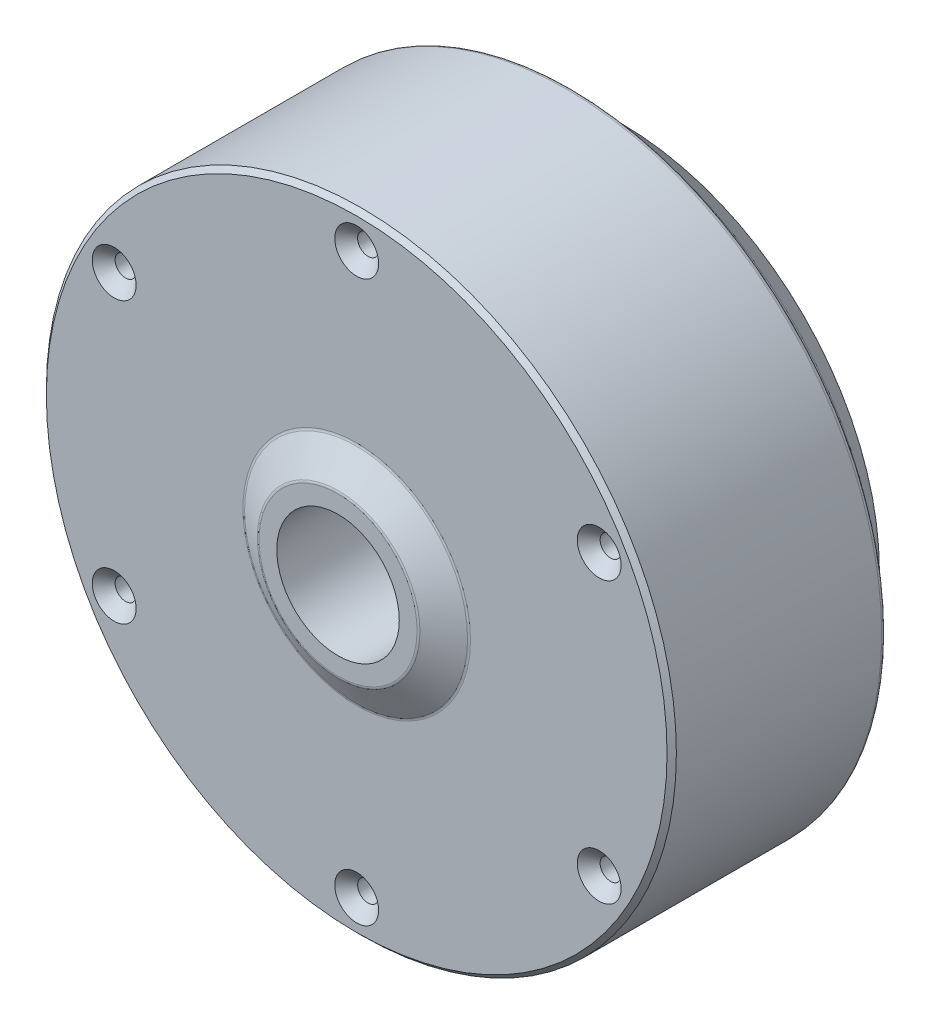
ISO-10303-21;
HEADER;
FILE_DESCRIPTION(('STEP AP214'),'2;1');
FILE_NAME('part.step','',(''),(''),'','','');
FILE_SCHEMA(('AUTOMOTIVE_DESIGN { 1 0 10303 214 1 1 1 1 }'));
ENDSEC;
DATA;
#1=APPLICATION_CONTEXT('core data for automotive mechanical design processes');
#2=APPLICATION_PROTOCOL_DEFINITION('international standard','automotive_design',2000,#1);
#3=PRODUCT_CONTEXT('',#1,'mechanical');
#4=PRODUCT('Part','Part','',(#3));
#5=PRODUCT_RELATED_PRODUCT_CATEGORY('part','',(#4));
#6=PRODUCT_DEFINITION_FORMATION('','',#4);
#7=PRODUCT_DEFINITION_CONTEXT('part definition',#1,'design');
#8=PRODUCT_DEFINITION('design','',#6,#7);
#9=PRODUCT_DEFINITION_SHAPE('','',#8);
#10=(LENGTH_UNIT() NAMED_UNIT(*) SI_UNIT(.MILLI.,.METRE.));
#11=(NAMED_UNIT(*) PLANE_ANGLE_UNIT() SI_UNIT($,.RADIAN.));
#12=(NAMED_UNIT(*) SI_UNIT($,.STERADIAN.) SOLID_ANGLE_UNIT());
#13=UNCERTAINTY_MEASURE_WITH_UNIT(LENGTH_MEASURE(1.E-05),#10,'distance_accuracy_value','');
#14=(GEOMETRIC_REPRESENTATION_CONTEXT(3) GLOBAL_UNCERTAINTY_ASSIGNED_CONTEXT((#13)) GLOBAL_UNIT_ASSIGNED_CONTEXT((#10,
#11,#12)) REPRESENTATION_CONTEXT('',''));
#15=CARTESIAN_POINT('',(0.,0.,0.));
#16=DIRECTION('',(0.,0.,1.));
#17=DIRECTION('',(1.,0.,0.));
#18=AXIS2_PLACEMENT_3D('',#15,#16,#17);
#19=CARTESIAN_POINT('',(0.,0.,46.));
#20=DIRECTION('',(0.,0.,-1.));
#21=DIRECTION('',(-1.,0.,0.));
#22=AXIS2_PLACEMENT_3D('',#19,#20,#21);
#23=CYLINDRICAL_SURFACE('',#22,67.5);
#24=CARTESIAN_POINT('',(0.,0.,1.));
#25=DIRECTION('',(0.,0.,1.));
#26=DIRECTION('',(1.,0.,0.));
#27=AXIS2_PLACEMENT_3D('',#24,#25,#26);
#28=CIRCLE('',#27,67.5);
#29=CARTESIAN_POINT('',(67.5,0.,1.));
#30=VERTEX_POINT('',#29);
#31=EDGE_CURVE('E208',#30,#30,#28,.T.);
#32=ORIENTED_EDGE('',*,*,#31,.T.);
#33=EDGE_LOOP('',(#32));
#34=FACE_BOUND('',#33,.T.);
#35=CARTESIAN_POINT('',(0.,0.,45.));
#36=DIRECTION('',(0.,0.,1.));
#37=DIRECTION('',(1.,0.,0.));
#38=AXIS2_PLACEMENT_3D('',#35,#36,#37);
#39=CIRCLE('',#38,67.5);
#40=CARTESIAN_POINT('',(67.5,0.,45.));
#41=VERTEX_POINT('',#40);
#42=EDGE_CURVE('E160',#41,#41,#39,.F.);
#43=ORIENTED_EDGE('',*,*,#42,.T.);
#44=EDGE_LOOP('',(#43));
#45=FACE_BOUND('',#44,.T.);
#46=ADVANCED_FACE('F49',(#34,#45),#23,.T.);
#47=CARTESIAN_POINT('',(0.,0.,46.));
#48=DIRECTION('',(0.,0.,-1.));
#49=DIRECTION('',(-1.,0.,0.));
#50=AXIS2_PLACEMENT_3D('',#47,#48,#49);
#51=CYLINDRICAL_SURFACE('',#50,13.125);
#52=CARTESIAN_POINT('',(0.,0.,-8.08578643762693));
#53=DIRECTION('',(0.,0.,1.));
#54=DIRECTION('',(1.,0.,0.));
#55=AXIS2_PLACEMENT_3D('',#52,#53,#54);
#56=CIRCLE('',#55,13.125);
#57=CARTESIAN_POINT('',(13.125,0.,-8.08578643762693));
#58=VERTEX_POINT('',#57);
#59=EDGE_CURVE('E180',#58,#58,#56,.F.);
#60=ORIENTED_EDGE('',*,*,#59,.T.);
#61=EDGE_LOOP('',(#60));
#62=FACE_BOUND('',#61,.T.);
#63=CARTESIAN_POINT('',(0.,0.,50.));
#64=DIRECTION('',(0.,0.,1.));
#65=DIRECTION('',(1.,0.,0.));
#66=AXIS2_PLACEMENT_3D('',#63,#64,#65);
#67=CIRCLE('',#66,13.125);
#68=CARTESIAN_POINT('',(13.125,0.,50.));
#69=VERTEX_POINT('',#68);
#70=EDGE_CURVE('E238',#69,#69,#67,.F.);
#71=ORIENTED_EDGE('',*,*,#70,.F.);
#72=EDGE_LOOP('',(#71));
#73=FACE_BOUND('',#72,.T.);
#74=ADVANCED_FACE('F252',(#62,#73),#51,.F.);
#75=CARTESIAN_POINT('',(0.,0.,46.));
#76=DIRECTION('',(0.,0.,1.));
#77=DIRECTION('',(1.,0.,0.));
#78=AXIS2_PLACEMENT_3D('',#75,#76,#77);
#79=PLANE('',#78);
#80=CARTESIAN_POINT('',(0.,0.,46.));
#81=DIRECTION('',(0.,0.,1.));
#82=DIRECTION('',(1.,0.,0.));
#83=AXIS2_PLACEMENT_3D('',#80,#81,#82);
#84=CIRCLE('',#83,24.392949192431);
#85=CARTESIAN_POINT('',(24.392949192431,0.,46.));
#86=VERTEX_POINT('',#85);
#87=EDGE_CURVE('E11',#86,#86,#84,.F.);
#88=ORIENTED_EDGE('',*,*,#87,.T.);
#89=EDGE_LOOP('',(#88));
#90=FACE_BOUND('',#89,.T.);
#91=CARTESIAN_POINT('',(0.,0.,46.));
#92=DIRECTION('',(0.,0.,1.));
#93=DIRECTION('',(1.,0.,0.));
#94=AXIS2_PLACEMENT_3D('',#91,#92,#93);
#95=CIRCLE('',#94,66.5);
#96=CARTESIAN_POINT('',(66.5,0.,46.));
#97=VERTEX_POINT('',#96);
#98=EDGE_CURVE('E156',#97,#97,#95,.T.);
#99=ORIENTED_EDGE('',*,*,#98,.T.);
#100=EDGE_LOOP('',(#99));
#101=FACE_BOUND('',#100,.T.);
#102=CARTESIAN_POINT('',(51.961524227066,30.0000000000006,46.));
#103=DIRECTION('',(0.,0.,1.));
#104=DIRECTION('',(1.,0.,0.));
#105=AXIS2_PLACEMENT_3D('',#102,#103,#104);
#106=CIRCLE('',#105,4.7);
#107=CARTESIAN_POINT('',(56.661524227066,30.0000000000006,46.));
#108=VERTEX_POINT('',#107);
#109=EDGE_CURVE('E97',#108,#108,#106,.T.);
#110=ORIENTED_EDGE('',*,*,#109,.F.);
#111=EDGE_LOOP('',(#110));
#112=FACE_BOUND('',#111,.T.);
#113=CARTESIAN_POINT('',(51.9615242270666,-29.9999999999995,46.));
#114=DIRECTION('',(0.,0.,1.));
#115=DIRECTION('',(1.,0.,0.));
#116=AXIS2_PLACEMENT_3D('',#113,#114,#115);
#117=CIRCLE('',#116,4.7);
#118=CARTESIAN_POINT('',(56.6615242270666,-29.9999999999995,46.));
#119=VERTEX_POINT('',#118);
#120=EDGE_CURVE('E88',#119,#119,#117,.T.);
#121=ORIENTED_EDGE('',*,*,#120,.F.);
#122=EDGE_LOOP('',(#121));
#123=FACE_BOUND('',#122,.T.);
#124=CARTESIAN_POINT('',(0.,-60.,46.));
#125=DIRECTION('',(0.,0.,1.));
#126=DIRECTION('',(1.,0.,0.));
#127=AXIS2_PLACEMENT_3D('',#124,#125,#126);
#128=CIRCLE('',#127,4.7);
#129=CARTESIAN_POINT('',(4.7,-60.,46.));
#130=VERTEX_POINT('',#129);
#131=EDGE_CURVE('E108',#130,#130,#128,.T.);
#132=ORIENTED_EDGE('',*,*,#131,.F.);
#133=EDGE_LOOP('',(#132));
#134=FACE_BOUND('',#133,.T.);
#135=CARTESIAN_POINT('',(-51.9615242270662,-30.0000000000002,46.));
#136=DIRECTION('',(0.,0.,1.));
#137=DIRECTION('',(1.,0.,0.));
#138=AXIS2_PLACEMENT_3D('',#135,#136,#137);
#139=CIRCLE('',#138,4.7);
#140=CARTESIAN_POINT('',(-47.2615242270662,-30.0000000000002,46.));
#141=VERTEX_POINT('',#140);
#142=EDGE_CURVE('E120',#141,#141,#139,.T.);
#143=ORIENTED_EDGE('',*,*,#142,.F.);
#144=EDGE_LOOP('',(#143));
#145=FACE_BOUND('',#144,.T.);
#146=CARTESIAN_POINT('',(-51.9615242270664,29.9999999999999,46.));
#147=DIRECTION('',(0.,0.,1.));
#148=DIRECTION('',(1.,0.,0.));
#149=AXIS2_PLACEMENT_3D('',#146,#147,#148);
#150=CIRCLE('',#149,4.7);
#151=CARTESIAN_POINT('',(-47.2615242270664,29.9999999999999,46.));
#152=VERTEX_POINT('',#151);
#153=EDGE_CURVE('E132',#152,#152,#150,.T.);
#154=ORIENTED_EDGE('',*,*,#153,.F.);
#155=EDGE_LOOP('',(#154));
#156=FACE_BOUND('',#155,.T.);
#157=CARTESIAN_POINT('',(0.,60.,46.));
#158=DIRECTION('',(0.,0.,1.));
#159=DIRECTION('',(1.,0.,0.));
#160=AXIS2_PLACEMENT_3D('',#157,#158,#159);
#161=CIRCLE('',#160,4.7);
#162=CARTESIAN_POINT('',(4.7,60.,46.));
#163=VERTEX_POINT('',#162);
#164=EDGE_CURVE('E144',#163,#163,#161,.T.);
#165=ORIENTED_EDGE('',*,*,#164,.F.);
#166=EDGE_LOOP('',(#165));
#167=FACE_BOUND('',#166,.T.);
#168=ADVANCED_FACE('F248',(#90,#101,#112,#123,#134,#145,#156,#167),#79,.T.);
#169=CARTESIAN_POINT('',(0.,0.,0.));
#170=DIRECTION('',(0.,0.,1.));
#171=DIRECTION('',(1.,0.,0.));
#172=AXIS2_PLACEMENT_3D('',#169,#170,#171);
#173=PLANE('',#172);
#174=CARTESIAN_POINT('',(0.,0.,0.));
#175=DIRECTION('',(0.,0.,1.));
#176=DIRECTION('',(1.,0.,0.));
#177=AXIS2_PLACEMENT_3D('',#174,#175,#176);
#178=CIRCLE('',#177,64.25);
#179=CARTESIAN_POINT('',(64.25,0.,0.));
#180=VERTEX_POINT('',#179);
#181=EDGE_CURVE('E204',#180,#180,#178,.T.);
#182=ORIENTED_EDGE('',*,*,#181,.T.);
#183=EDGE_LOOP('',(#182));
#184=FACE_BOUND('',#183,.T.);
#185=CARTESIAN_POINT('',(0.,0.,0.));
#186=DIRECTION('',(0.,0.,1.));
#187=DIRECTION('',(1.,0.,0.));
#188=AXIS2_PLACEMENT_3D('',#185,#186,#187);
#189=CIRCLE('',#188,66.5);
#190=CARTESIAN_POINT('',(66.5,0.,0.));
#191=VERTEX_POINT('',#190);
#192=EDGE_CURVE('E200',#191,#191,#189,.F.);
#193=ORIENTED_EDGE('',*,*,#192,.T.);
#194=EDGE_LOOP('',(#193));
#195=FACE_BOUND('',#194,.T.);
#196=ADVANCED_FACE('F251',(#184,#195),#173,.F.);
#197=CARTESIAN_POINT('',(0.,0.,-11.));
#198=DIRECTION('',(0.,0.,1.));
#199=DIRECTION('',(1.,0.,0.));
#200=AXIS2_PLACEMENT_3D('',#197,#198,#199);
#201=PLANE('',#200);
#202=CARTESIAN_POINT('',(0.,0.,-11.));
#203=DIRECTION('',(0.,0.,1.));
#204=DIRECTION('',(1.,0.,0.));
#205=AXIS2_PLACEMENT_3D('',#202,#203,#204);
#206=CIRCLE('',#205,16.0392135623731);
#207=CARTESIAN_POINT('',(16.0392135623731,0.,-11.));
#208=VERTEX_POINT('',#207);
#209=EDGE_CURVE('E168',#208,#208,#206,.T.);
#210=ORIENTED_EDGE('',*,*,#209,.T.);
#211=EDGE_LOOP('',(#210));
#212=FACE_BOUND('',#211,.T.);
#213=CARTESIAN_POINT('',(0.,0.,-11.));
#214=DIRECTION('',(0.,0.,1.));
#215=DIRECTION('',(1.,0.,0.));
#216=AXIS2_PLACEMENT_3D('',#213,#214,#215);
#217=CIRCLE('',#216,54.585786437627);
#218=CARTESIAN_POINT('',(54.585786437627,0.,-11.));
#219=VERTEX_POINT('',#218);
#220=EDGE_CURVE('E164',#219,#219,#217,.F.);
#221=ORIENTED_EDGE('',*,*,#220,.T.);
#222=EDGE_LOOP('',(#221));
#223=FACE_BOUND('',#222,.T.);
#224=ADVANCED_FACE('F558',(#212,#223),#201,.F.);
#225=CARTESIAN_POINT('',(0.,60.,35.351936392812));
#226=DIRECTION('',(0.,0.,1.));
#227=DIRECTION('',(1.,0.,0.));
#228=AXIS2_PLACEMENT_3D('',#225,#226,#227);
#229=CONICAL_SURFACE('',#228,2.25,1.02974425867665);
#230=CARTESIAN_POINT('',(0.,60.,34.));
#231=VERTEX_POINT('',#230);
#232=VERTEX_LOOP('',#231);
#233=FACE_BOUND('',#232,.T.);
#234=CARTESIAN_POINT('',(0.,60.,35.351936392812));
#235=DIRECTION('',(0.,0.,1.));
#236=DIRECTION('',(1.,0.,0.));
#237=AXIS2_PLACEMENT_3D('',#234,#235,#236);
#238=CIRCLE('',#237,2.25);
#239=CARTESIAN_POINT('',(2.25,60.,35.351936392812));
#240=VERTEX_POINT('',#239);
#241=EDGE_CURVE('E152',#240,#240,#238,.T.);
#242=ORIENTED_EDGE('',*,*,#241,.T.);
#243=EDGE_LOOP('',(#242));
#244=FACE_BOUND('',#243,.T.);
#245=ADVANCED_FACE('F277',(#233,#244),#229,.F.);
#246=CARTESIAN_POINT('',(0.,60.,46.));
#247=DIRECTION('',(0.,0.,1.));
#248=DIRECTION('',(1.,0.,0.));
#249=AXIS2_PLACEMENT_3D('',#246,#247,#248);
#250=CYLINDRICAL_SURFACE('',#249,2.25);
#251=ORIENTED_EDGE('',*,*,#241,.F.);
#252=EDGE_LOOP('',(#251));
#253=FACE_BOUND('',#252,.T.);
#254=CARTESIAN_POINT('',(0.,60.,43.55));
#255=DIRECTION('',(0.,0.,1.));
#256=DIRECTION('',(1.,0.,0.));
#257=AXIS2_PLACEMENT_3D('',#254,#255,#256);
#258=CIRCLE('',#257,2.25);
#259=CARTESIAN_POINT('',(2.25,60.,43.55));
#260=VERTEX_POINT('',#259);
#261=EDGE_CURVE('E148',#260,#260,#258,.T.);
#262=ORIENTED_EDGE('',*,*,#261,.T.);
#263=EDGE_LOOP('',(#262));
#264=FACE_BOUND('',#263,.T.);
#265=ADVANCED_FACE('F268',(#253,#264),#250,.F.);
#266=CARTESIAN_POINT('',(0.,60.,46.));
#267=DIRECTION('',(0.,0.,1.));
#268=DIRECTION('',(1.,0.,0.));
#269=AXIS2_PLACEMENT_3D('',#266,#267,#268);
#270=CONICAL_SURFACE('',#269,4.7,0.785398163397448);
#271=ORIENTED_EDGE('',*,*,#261,.F.);
#272=EDGE_LOOP('',(#271));
#273=FACE_BOUND('',#272,.T.);
#274=ORIENTED_EDGE('',*,*,#164,.T.);
#275=EDGE_LOOP('',(#274));
#276=FACE_BOUND('',#275,.T.);
#277=ADVANCED_FACE('F265',(#273,#276),#270,.F.);
#278=CARTESIAN_POINT('',(-51.9615242270664,29.9999999999999,35.351936392812));
#279=DIRECTION('',(0.,0.,1.));
#280=DIRECTION('',(1.,0.,0.));
#281=AXIS2_PLACEMENT_3D('',#278,#279,#280);
#282=CONICAL_SURFACE('',#281,2.25,1.02974425867665);
#283=CARTESIAN_POINT('',(-51.9615242270664,29.9999999999999,34.));
#284=VERTEX_POINT('',#283);
#285=VERTEX_LOOP('',#284);
#286=FACE_BOUND('',#285,.T.);
#287=CARTESIAN_POINT('',(-51.9615242270664,29.9999999999999,35.351936392812));
#288=DIRECTION('',(0.,0.,1.));
#289=DIRECTION('',(1.,0.,0.));
#290=AXIS2_PLACEMENT_3D('',#287,#288,#289);
#291=CIRCLE('',#290,2.25);
#292=CARTESIAN_POINT('',(-49.7115242270664,29.9999999999999,35.351936392812));
#293=VERTEX_POINT('',#292);
#294=EDGE_CURVE('E140',#293,#293,#291,.T.);
#295=ORIENTED_EDGE('',*,*,#294,.T.);
#296=EDGE_LOOP('',(#295));
#297=FACE_BOUND('',#296,.T.);
#298=ADVANCED_FACE('F267',(#286,#297),#282,.F.);
#299=CARTESIAN_POINT('',(-51.9615242270664,29.9999999999999,46.));
#300=DIRECTION('',(0.,0.,1.));
#301=DIRECTION('',(1.,0.,0.));
#302=AXIS2_PLACEMENT_3D('',#299,#300,#301);
#303=CYLINDRICAL_SURFACE('',#302,2.25);
#304=ORIENTED_EDGE('',*,*,#294,.F.);
#305=EDGE_LOOP('',(#304));
#306=FACE_BOUND('',#305,.T.);
#307=CARTESIAN_POINT('',(-51.9615242270664,29.9999999999999,43.55));
#308=DIRECTION('',(0.,0.,1.));
#309=DIRECTION('',(1.,0.,0.));
#310=AXIS2_PLACEMENT_3D('',#307,#308,#309);
#311=CIRCLE('',#310,2.25);
#312=CARTESIAN_POINT('',(-49.7115242270664,29.9999999999999,43.55));
#313=VERTEX_POINT('',#312);
#314=EDGE_CURVE('E136',#313,#313,#311,.T.);
#315=ORIENTED_EDGE('',*,*,#314,.T.);
#316=EDGE_LOOP('',(#315));
#317=FACE_BOUND('',#316,.T.);
#318=ADVANCED_FACE('F275',(#306,#317),#303,.F.);
#319=CARTESIAN_POINT('',(-51.9615242270664,29.9999999999999,46.));
#320=DIRECTION('',(0.,0.,1.));
#321=DIRECTION('',(1.,0.,0.));
#322=AXIS2_PLACEMENT_3D('',#319,#320,#321);
#323=CONICAL_SURFACE('',#322,4.7,0.785398163397447);
#324=ORIENTED_EDGE('',*,*,#314,.F.);
#325=EDGE_LOOP('',(#324));
#326=FACE_BOUND('',#325,.T.);
#327=ORIENTED_EDGE('',*,*,#153,.T.);
#328=EDGE_LOOP('',(#327));
#329=FACE_BOUND('',#328,.T.);
#330=ADVANCED_FACE('F519',(#326,#329),#323,.F.);
#331=CARTESIAN_POINT('',(-51.9615242270662,-30.0000000000002,35.351936392812));
#332=DIRECTION('',(0.,0.,1.));
#333=DIRECTION('',(1.,0.,0.));
#334=AXIS2_PLACEMENT_3D('',#331,#332,#333);
#335=CONICAL_SURFACE('',#334,2.25,1.02974425867665);
#336=CARTESIAN_POINT('',(-51.9615242270662,-30.0000000000002,34.));
#337=VERTEX_POINT('',#336);
#338=VERTEX_LOOP('',#337);
#339=FACE_BOUND('',#338,.T.);
#340=CARTESIAN_POINT('',(-51.9615242270662,-30.0000000000002,35.351936392812));
#341=DIRECTION('',(0.,0.,1.));
#342=DIRECTION('',(1.,0.,0.));
#343=AXIS2_PLACEMENT_3D('',#340,#341,#342);
#344=CIRCLE('',#343,2.25);
#345=CARTESIAN_POINT('',(-49.7115242270662,-30.0000000000002,35.351936392812));
#346=VERTEX_POINT('',#345);
#347=EDGE_CURVE('E128',#346,#346,#344,.T.);
#348=ORIENTED_EDGE('',*,*,#347,.T.);
#349=EDGE_LOOP('',(#348));
#350=FACE_BOUND('',#349,.T.);
#351=ADVANCED_FACE('F510',(#339,#350),#335,.F.);
#352=CARTESIAN_POINT('',(-51.9615242270662,-30.0000000000002,46.));
#353=DIRECTION('',(0.,0.,1.));
#354=DIRECTION('',(1.,0.,0.));
#355=AXIS2_PLACEMENT_3D('',#352,#353,#354);
#356=CYLINDRICAL_SURFACE('',#355,2.25);
#357=ORIENTED_EDGE('',*,*,#347,.F.);
#358=EDGE_LOOP('',(#357));
#359=FACE_BOUND('',#358,.T.);
#360=CARTESIAN_POINT('',(-51.9615242270662,-30.0000000000002,43.55));
#361=DIRECTION('',(0.,0.,1.));
#362=DIRECTION('',(1.,0.,0.));
#363=AXIS2_PLACEMENT_3D('',#360,#361,#362);
#364=CIRCLE('',#363,2.25);
#365=CARTESIAN_POINT('',(-49.7115242270662,-30.0000000000002,43.55));
#366=VERTEX_POINT('',#365);
#367=EDGE_CURVE('E124',#366,#366,#364,.T.);
#368=ORIENTED_EDGE('',*,*,#367,.T.);
#369=EDGE_LOOP('',(#368));
#370=FACE_BOUND('',#369,.T.);
#371=ADVANCED_FACE('F501',(#359,#370),#356,.F.);
#372=CARTESIAN_POINT('',(-51.9615242270662,-30.0000000000002,46.));
#373=DIRECTION('',(0.,0.,1.));
#374=DIRECTION('',(1.,0.,0.));
#375=AXIS2_PLACEMENT_3D('',#372,#373,#374);
#376=CONICAL_SURFACE('',#375,4.7,0.785398163397448);
#377=ORIENTED_EDGE('',*,*,#367,.F.);
#378=EDGE_LOOP('',(#377));
#379=FACE_BOUND('',#378,.T.);
#380=ORIENTED_EDGE('',*,*,#142,.T.);
#381=EDGE_LOOP('',(#380));
#382=FACE_BOUND('',#381,.T.);
#383=ADVANCED_FACE('F492',(#379,#382),#376,.F.);
#384=CARTESIAN_POINT('',(0.,-60.,35.351936392812));
#385=DIRECTION('',(0.,0.,1.));
#386=DIRECTION('',(1.,0.,0.));
#387=AXIS2_PLACEMENT_3D('',#384,#385,#386);
#388=CONICAL_SURFACE('',#387,2.25,1.02974425867665);
#389=CARTESIAN_POINT('',(0.,-60.,34.));
#390=VERTEX_POINT('',#389);
#391=VERTEX_LOOP('',#390);
#392=FACE_BOUND('',#391,.T.);
#393=CARTESIAN_POINT('',(0.,-60.,35.351936392812));
#394=DIRECTION('',(0.,0.,1.));
#395=DIRECTION('',(1.,0.,0.));
#396=AXIS2_PLACEMENT_3D('',#393,#394,#395);
#397=CIRCLE('',#396,2.25);
#398=CARTESIAN_POINT('',(2.25,-60.,35.351936392812));
#399=VERTEX_POINT('',#398);
#400=EDGE_CURVE('E116',#399,#399,#397,.T.);
#401=ORIENTED_EDGE('',*,*,#400,.T.);
#402=EDGE_LOOP('',(#401));
#403=FACE_BOUND('',#402,.T.);
#404=ADVANCED_FACE('F483',(#392,#403),#388,.F.);
#405=CARTESIAN_POINT('',(0.,-60.,46.));
#406=DIRECTION('',(0.,0.,1.));
#407=DIRECTION('',(1.,0.,0.));
#408=AXIS2_PLACEMENT_3D('',#405,#406,#407);
#409=CYLINDRICAL_SURFACE('',#408,2.25);
#410=ORIENTED_EDGE('',*,*,#400,.F.);
#411=EDGE_LOOP('',(#410));
#412=FACE_BOUND('',#411,.T.);
#413=CARTESIAN_POINT('',(0.,-60.,43.55));
#414=DIRECTION('',(0.,0.,1.));
#415=DIRECTION('',(1.,0.,0.));
#416=AXIS2_PLACEMENT_3D('',#413,#414,#415);
#417=CIRCLE('',#416,2.25);
#418=CARTESIAN_POINT('',(2.25,-60.,43.55));
#419=VERTEX_POINT('',#418);
#420=EDGE_CURVE('E112',#419,#419,#417,.T.);
#421=ORIENTED_EDGE('',*,*,#420,.T.);
#422=EDGE_LOOP('',(#421));
#423=FACE_BOUND('',#422,.T.);
#424=ADVANCED_FACE('F474',(#412,#423),#409,.F.);
#425=CARTESIAN_POINT('',(0.,-60.,46.));
#426=DIRECTION('',(0.,0.,1.));
#427=DIRECTION('',(1.,0.,0.));
#428=AXIS2_PLACEMENT_3D('',#425,#426,#427);
#429=CONICAL_SURFACE('',#428,4.7,0.785398163397448);
#430=ORIENTED_EDGE('',*,*,#420,.F.);
#431=EDGE_LOOP('',(#430));
#432=FACE_BOUND('',#431,.T.);
#433=ORIENTED_EDGE('',*,*,#131,.T.);
#434=EDGE_LOOP('',(#433));
#435=FACE_BOUND('',#434,.T.);
#436=ADVANCED_FACE('F465',(#432,#435),#429,.F.);
#437=CARTESIAN_POINT('',(51.9615242270666,-29.9999999999995,35.351936392812));
#438=DIRECTION('',(0.,0.,1.));
#439=DIRECTION('',(1.,0.,0.));
#440=AXIS2_PLACEMENT_3D('',#437,#438,#439);
#441=CONICAL_SURFACE('',#440,2.25,1.02974425867665);
#442=CARTESIAN_POINT('',(51.9615242270666,-29.9999999999995,34.));
#443=VERTEX_POINT('',#442);
#444=VERTEX_LOOP('',#443);
#445=FACE_BOUND('',#444,.T.);
#446=CARTESIAN_POINT('',(51.9615242270666,-29.9999999999995,35.351936392812));
#447=DIRECTION('',(0.,0.,1.));
#448=DIRECTION('',(1.,0.,0.));
#449=AXIS2_PLACEMENT_3D('',#446,#447,#448);
#450=CIRCLE('',#449,2.25);
#451=CARTESIAN_POINT('',(54.2115242270666,-29.9999999999995,35.351936392812));
#452=VERTEX_POINT('',#451);
#453=EDGE_CURVE('E104',#452,#452,#450,.T.);
#454=ORIENTED_EDGE('',*,*,#453,.T.);
#455=EDGE_LOOP('',(#454));
#456=FACE_BOUND('',#455,.T.);
#457=ADVANCED_FACE('F456',(#445,#456),#441,.F.);
#458=CARTESIAN_POINT('',(51.9615242270666,-29.9999999999995,46.));
#459=DIRECTION('',(0.,0.,1.));
#460=DIRECTION('',(1.,0.,0.));
#461=AXIS2_PLACEMENT_3D('',#458,#459,#460);
#462=CYLINDRICAL_SURFACE('',#461,2.25);
#463=ORIENTED_EDGE('',*,*,#453,.F.);
#464=EDGE_LOOP('',(#463));
#465=FACE_BOUND('',#464,.T.);
#466=CARTESIAN_POINT('',(51.9615242270666,-29.9999999999995,43.55));
#467=DIRECTION('',(0.,0.,1.));
#468=DIRECTION('',(1.,0.,0.));
#469=AXIS2_PLACEMENT_3D('',#466,#467,#468);
#470=CIRCLE('',#469,2.25);
#471=CARTESIAN_POINT('',(54.2115242270666,-29.9999999999995,43.55));
#472=VERTEX_POINT('',#471);
#473=EDGE_CURVE('E94',#472,#472,#470,.T.);
#474=ORIENTED_EDGE('',*,*,#473,.T.);
#475=EDGE_LOOP('',(#474));
#476=FACE_BOUND('',#475,.T.);
#477=ADVANCED_FACE('F447',(#465,#476),#462,.F.);
#478=CARTESIAN_POINT('',(51.9615242270666,-29.9999999999995,46.));
#479=DIRECTION('',(0.,0.,1.));
#480=DIRECTION('',(1.,0.,0.));
#481=AXIS2_PLACEMENT_3D('',#478,#479,#480);
#482=CONICAL_SURFACE('',#481,4.7,0.785398163397447);
#483=ORIENTED_EDGE('',*,*,#473,.F.);
#484=EDGE_LOOP('',(#483));
#485=FACE_BOUND('',#484,.T.);
#486=ORIENTED_EDGE('',*,*,#120,.T.);
#487=EDGE_LOOP('',(#486));
#488=FACE_BOUND('',#487,.T.);
#489=ADVANCED_FACE('F81',(#485,#488),#482,.F.);
#490=CARTESIAN_POINT('',(51.961524227066,30.0000000000006,35.351936392812));
#491=DIRECTION('',(0.,0.,1.));
#492=DIRECTION('',(1.,0.,0.));
#493=AXIS2_PLACEMENT_3D('',#490,#491,#492);
#494=CONICAL_SURFACE('',#493,2.25,1.02974425867665);
#495=CARTESIAN_POINT('',(51.961524227066,30.0000000000006,34.));
#496=VERTEX_POINT('',#495);
#497=VERTEX_LOOP('',#496);
#498=FACE_BOUND('',#497,.T.);
#499=CARTESIAN_POINT('',(51.961524227066,30.0000000000006,35.351936392812));
#500=DIRECTION('',(0.,0.,1.));
#501=DIRECTION('',(1.,0.,0.));
#502=AXIS2_PLACEMENT_3D('',#499,#500,#501);
#503=CIRCLE('',#502,2.25);
#504=CARTESIAN_POINT('',(54.211524227066,30.0000000000006,35.351936392812));
#505=VERTEX_POINT('',#504);
#506=EDGE_CURVE('E85',#505,#505,#503,.T.);
#507=ORIENTED_EDGE('',*,*,#506,.T.);
#508=EDGE_LOOP('',(#507));
#509=FACE_BOUND('',#508,.T.);
#510=ADVANCED_FACE('F77',(#498,#509),#494,.F.);
#511=CARTESIAN_POINT('',(51.961524227066,30.0000000000006,46.));
#512=DIRECTION('',(0.,0.,1.));
#513=DIRECTION('',(1.,0.,0.));
#514=AXIS2_PLACEMENT_3D('',#511,#512,#513);
#515=CYLINDRICAL_SURFACE('',#514,2.25);
#516=ORIENTED_EDGE('',*,*,#506,.F.);
#517=EDGE_LOOP('',(#516));
#518=FACE_BOUND('',#517,.T.);
#519=CARTESIAN_POINT('',(51.961524227066,30.0000000000006,43.55));
#520=DIRECTION('',(0.,0.,1.));
#521=DIRECTION('',(1.,0.,0.));
#522=AXIS2_PLACEMENT_3D('',#519,#520,#521);
#523=CIRCLE('',#522,2.25);
#524=CARTESIAN_POINT('',(54.211524227066,30.0000000000006,43.55));
#525=VERTEX_POINT('',#524);
#526=EDGE_CURVE('E89',#525,#525,#523,.T.);
#527=ORIENTED_EDGE('',*,*,#526,.T.);
#528=EDGE_LOOP('',(#527));
#529=FACE_BOUND('',#528,.T.);
#530=ADVANCED_FACE('F80',(#518,#529),#515,.F.);
#531=CARTESIAN_POINT('',(51.961524227066,30.0000000000006,46.));
#532=DIRECTION('',(0.,0.,1.));
#533=DIRECTION('',(1.,0.,0.));
#534=AXIS2_PLACEMENT_3D('',#531,#532,#533);
#535=CONICAL_SURFACE('',#534,4.7,0.785398163397448);
#536=ORIENTED_EDGE('',*,*,#526,.F.);
#537=EDGE_LOOP('',(#536));
#538=FACE_BOUND('',#537,.T.);
#539=ORIENTED_EDGE('',*,*,#109,.T.);
#540=EDGE_LOOP('',(#539));
#541=FACE_BOUND('',#540,.T.);
#542=ADVANCED_FACE('F246',(#538,#541),#535,.F.);
#543=CARTESIAN_POINT('',(0.,0.,46.));
#544=DIRECTION('',(0.,0.,-1.));
#545=DIRECTION('',(-1.,0.,0.));
#546=AXIS2_PLACEMENT_3D('',#543,#544,#545);
#547=CONICAL_SURFACE('',#546,66.5,0.785398163397441);
#548=ORIENTED_EDGE('',*,*,#42,.F.);
#549=EDGE_LOOP('',(#548));
#550=FACE_BOUND('',#549,.T.);
#551=ORIENTED_EDGE('',*,*,#98,.F.);
#552=EDGE_LOOP('',(#551));
#553=FACE_BOUND('',#552,.T.);
#554=ADVANCED_FACE('F295',(#550,#553),#547,.T.);
#555=CARTESIAN_POINT('',(0.,0.,-1.));
#556=DIRECTION('',(0.,0.,1.));
#557=DIRECTION('',(1.,0.,0.));
#558=AXIS2_PLACEMENT_3D('',#555,#556,#557);
#559=CYLINDRICAL_SURFACE('',#558,63.25);
#560=CARTESIAN_POINT('',(0.,0.,-2.33578643762705));
#561=DIRECTION('',(0.,0.,-1.));
#562=DIRECTION('',(-1.,0.,0.));
#563=AXIS2_PLACEMENT_3D('',#560,#561,#562);
#564=CIRCLE('',#563,63.25);
#565=CARTESIAN_POINT('',(-63.25,0.,-2.33578643762705));
#566=VERTEX_POINT('',#565);
#567=EDGE_CURVE('E196',#566,#566,#564,.F.);
#568=ORIENTED_EDGE('',*,*,#567,.T.);
#569=EDGE_LOOP('',(#568));
#570=FACE_BOUND('',#569,.T.);
#571=CARTESIAN_POINT('',(0.,0.,-1.));
#572=DIRECTION('',(0.,0.,1.));
#573=DIRECTION('',(1.,0.,0.));
#574=AXIS2_PLACEMENT_3D('',#571,#572,#573);
#575=CIRCLE('',#574,63.25);
#576=CARTESIAN_POINT('',(63.25,0.,-1.));
#577=VERTEX_POINT('',#576);
#578=EDGE_CURVE('E192',#577,#577,#575,.F.);
#579=ORIENTED_EDGE('',*,*,#578,.T.);
#580=EDGE_LOOP('',(#579));
#581=FACE_BOUND('',#580,.T.);
#582=ADVANCED_FACE('F300',(#570,#581),#559,.T.);
#583=CARTESIAN_POINT('',(0.,0.,-1.));
#584=DIRECTION('',(0.,0.,1.));
#585=DIRECTION('',(1.,0.,0.));
#586=AXIS2_PLACEMENT_3D('',#583,#584,#585);
#587=CONICAL_SURFACE('',#586,65.0000000000002,0.785398163397453);
#588=CARTESIAN_POINT('',(0.,0.,-10.7071067811865));
#589=DIRECTION('',(0.,0.,-1.));
#590=DIRECTION('',(-1.,0.,0.));
#591=AXIS2_PLACEMENT_3D('',#588,#589,#590);
#592=CIRCLE('',#591,55.2928932188135);
#593=CARTESIAN_POINT('',(-55.2928932188135,0.,-10.7071067811865));
#594=VERTEX_POINT('',#593);
#595=EDGE_CURVE('E188',#594,#594,#592,.F.);
#596=ORIENTED_EDGE('',*,*,#595,.T.);
#597=EDGE_LOOP('',(#596));
#598=FACE_BOUND('',#597,.T.);
#599=CARTESIAN_POINT('',(0.,0.,-3.0428932188136));
#600=DIRECTION('',(0.,0.,1.));
#601=DIRECTION('',(1.,0.,0.));
#602=AXIS2_PLACEMENT_3D('',#599,#600,#601);
#603=CIRCLE('',#602,62.9571067811865);
#604=CARTESIAN_POINT('',(62.9571067811865,0.,-3.0428932188136));
#605=VERTEX_POINT('',#604);
#606=EDGE_CURVE('E184',#605,#605,#603,.F.);
#607=ORIENTED_EDGE('',*,*,#606,.T.);
#608=EDGE_LOOP('',(#607));
#609=FACE_BOUND('',#608,.T.);
#610=ADVANCED_FACE('F302',(#598,#609),#587,.T.);
#611=CARTESIAN_POINT('',(0.,0.,-11.));
#612=DIRECTION('',(0.,0.,-1.));
#613=DIRECTION('',(-1.,0.,0.));
#614=AXIS2_PLACEMENT_3D('',#611,#612,#613);
#615=CONICAL_SURFACE('',#614,15.625,0.785398163397448);
#616=CARTESIAN_POINT('',(0.,0.,-10.7071067811865));
#617=DIRECTION('',(0.,0.,-1.));
#618=DIRECTION('',(-1.,0.,0.));
#619=AXIS2_PLACEMENT_3D('',#616,#617,#618);
#620=CIRCLE('',#619,15.3321067811865);
#621=CARTESIAN_POINT('',(-15.3321067811865,0.,-10.7071067811865));
#622=VERTEX_POINT('',#621);
#623=EDGE_CURVE('E176',#622,#622,#620,.T.);
#624=ORIENTED_EDGE('',*,*,#623,.T.);
#625=EDGE_LOOP('',(#624));
#626=FACE_BOUND('',#625,.T.);
#627=CARTESIAN_POINT('',(0.,0.,-8.79289321881347));
#628=DIRECTION('',(0.,0.,1.));
#629=DIRECTION('',(1.,0.,0.));
#630=AXIS2_PLACEMENT_3D('',#627,#628,#629);
#631=CIRCLE('',#630,13.4178932188135);
#632=CARTESIAN_POINT('',(13.4178932188135,0.,-8.79289321881347));
#633=VERTEX_POINT('',#632);
#634=EDGE_CURVE('E172',#633,#633,#631,.T.);
#635=ORIENTED_EDGE('',*,*,#634,.T.);
#636=EDGE_LOOP('',(#635));
#637=FACE_BOUND('',#636,.T.);
#638=ADVANCED_FACE('F308',(#626,#637),#615,.F.);
#639=CARTESIAN_POINT('',(0.,0.,-10.));
#640=DIRECTION('',(0.,0.,1.));
#641=DIRECTION('',(1.,0.,0.));
#642=AXIS2_PLACEMENT_3D('',#639,#640,#641);
#643=TOROIDAL_SURFACE('',#642,16.0392135623731,1.);
#644=ORIENTED_EDGE('',*,*,#623,.F.);
#645=EDGE_LOOP('',(#644));
#646=FACE_BOUND('',#645,.T.);
#647=ORIENTED_EDGE('',*,*,#209,.F.);
#648=EDGE_LOOP('',(#647));
#649=FACE_BOUND('',#648,.T.);
#650=ADVANCED_FACE('F315',(#646,#649),#643,.T.);
#651=CARTESIAN_POINT('',(0.,0.,-8.08578643762693));
#652=DIRECTION('',(0.,0.,1.));
#653=DIRECTION('',(1.,0.,0.));
#654=AXIS2_PLACEMENT_3D('',#651,#652,#653);
#655=TOROIDAL_SURFACE('',#654,14.125,1.);
#656=ORIENTED_EDGE('',*,*,#634,.F.);
#657=EDGE_LOOP('',(#656));
#658=FACE_BOUND('',#657,.T.);
#659=ORIENTED_EDGE('',*,*,#59,.F.);
#660=EDGE_LOOP('',(#659));
#661=FACE_BOUND('',#660,.T.);
#662=ADVANCED_FACE('F319',(#658,#661),#655,.T.);
#663=CARTESIAN_POINT('',(0.,0.,-10.));
#664=DIRECTION('',(0.,0.,1.));
#665=DIRECTION('',(1.,0.,0.));
#666=AXIS2_PLACEMENT_3D('',#663,#664,#665);
#667=TOROIDAL_SURFACE('',#666,54.585786437627,1.);
#668=ORIENTED_EDGE('',*,*,#220,.F.);
#669=EDGE_LOOP('',(#668));
#670=FACE_BOUND('',#669,.T.);
#671=ORIENTED_EDGE('',*,*,#595,.F.);
#672=EDGE_LOOP('',(#671));
#673=FACE_BOUND('',#672,.T.);
#674=ADVANCED_FACE('F323',(#670,#673),#667,.T.);
#675=CARTESIAN_POINT('',(0.,0.,-2.33578643762705));
#676=DIRECTION('',(0.,0.,-1.));
#677=DIRECTION('',(-1.,0.,0.));
#678=AXIS2_PLACEMENT_3D('',#675,#676,#677);
#679=TOROIDAL_SURFACE('',#678,62.25,1.);
#680=ORIENTED_EDGE('',*,*,#606,.F.);
#681=EDGE_LOOP('',(#680));
#682=FACE_BOUND('',#681,.T.);
#683=ORIENTED_EDGE('',*,*,#567,.F.);
#684=EDGE_LOOP('',(#683));
#685=FACE_BOUND('',#684,.T.);
#686=ADVANCED_FACE('F327',(#682,#685),#679,.T.);
#687=CARTESIAN_POINT('',(0.,0.,-1.));
#688=DIRECTION('',(0.,0.,1.));
#689=DIRECTION('',(1.,0.,0.));
#690=AXIS2_PLACEMENT_3D('',#687,#688,#689);
#691=TOROIDAL_SURFACE('',#690,64.25,1.);
#692=ORIENTED_EDGE('',*,*,#578,.F.);
#693=EDGE_LOOP('',(#692));
#694=FACE_BOUND('',#693,.T.);
#695=ORIENTED_EDGE('',*,*,#181,.F.);
#696=EDGE_LOOP('',(#695));
#697=FACE_BOUND('',#696,.T.);
#698=ADVANCED_FACE('F331',(#694,#697),#691,.F.);
#699=CARTESIAN_POINT('',(0.,0.,1.));
#700=DIRECTION('',(0.,0.,1.));
#701=DIRECTION('',(1.,0.,0.));
#702=AXIS2_PLACEMENT_3D('',#699,#700,#701);
#703=TOROIDAL_SURFACE('',#702,66.5,1.);
#704=ORIENTED_EDGE('',*,*,#192,.F.);
#705=EDGE_LOOP('',(#704));
#706=FACE_BOUND('',#705,.T.);
#707=ORIENTED_EDGE('',*,*,#31,.F.);
#708=EDGE_LOOP('',(#707));
#709=FACE_BOUND('',#708,.T.);
#710=ADVANCED_FACE('F234',(#706,#709),#703,.T.);
#711=CARTESIAN_POINT('',(0.,0.,50.));
#712=DIRECTION('',(0.,0.,1.));
#713=DIRECTION('',(1.,0.,0.));
#714=AXIS2_PLACEMENT_3D('',#711,#712,#713);
#715=PLANE('',#714);
#716=CARTESIAN_POINT('',(0.,0.,50.));
#717=DIRECTION('',(0.,0.,1.));
#718=DIRECTION('',(1.,0.,0.));
#719=AXIS2_PLACEMENT_3D('',#716,#717,#718);
#720=CIRCLE('',#719,16.9288475772933);
#721=CARTESIAN_POINT('',(16.9288475772933,0.,50.));
#722=VERTEX_POINT('',#721);
#723=EDGE_CURVE('E212',#722,#722,#720,.T.);
#724=ORIENTED_EDGE('',*,*,#723,.T.);
#725=EDGE_LOOP('',(#724));
#726=FACE_BOUND('',#725,.T.);
#727=ORIENTED_EDGE('',*,*,#70,.T.);
#728=EDGE_LOOP('',(#727));
#729=FACE_BOUND('',#728,.T.);
#730=ADVANCED_FACE('F231',(#726,#729),#715,.T.);
#731=CARTESIAN_POINT('',(0.,0.,50.));
#732=DIRECTION('',(0.,0.,-1.));
#733=DIRECTION('',(-1.,0.,0.));
#734=AXIS2_PLACEMENT_3D('',#731,#732,#733);
#735=CONICAL_SURFACE('',#734,17.1967967697244,1.0471975511966);
#736=CARTESIAN_POINT('',(0.,0.,49.8660254037844));
#737=DIRECTION('',(0.,0.,1.));
#738=DIRECTION('',(1.,0.,0.));
#739=AXIS2_PLACEMENT_3D('',#736,#737,#738);
#740=CIRCLE('',#739,17.4288475772933);
#741=CARTESIAN_POINT('',(17.4288475772933,0.,49.8660254037844));
#742=VERTEX_POINT('',#741);
#743=EDGE_CURVE('E58',#742,#742,#740,.F.);
#744=ORIENTED_EDGE('',*,*,#743,.T.);
#745=EDGE_LOOP('',(#744));
#746=FACE_BOUND('',#745,.T.);
#747=CARTESIAN_POINT('',(0.,0.,46.1339745962156));
#748=DIRECTION('',(0.,0.,-1.));
#749=DIRECTION('',(-1.,0.,0.));
#750=AXIS2_PLACEMENT_3D('',#747,#748,#749);
#751=CIRCLE('',#750,23.892949192431);
#752=CARTESIAN_POINT('',(-23.892949192431,0.,46.1339745962156));
#753=VERTEX_POINT('',#752);
#754=EDGE_CURVE('E216',#753,#753,#751,.F.);
#755=ORIENTED_EDGE('',*,*,#754,.T.);
#756=EDGE_LOOP('',(#755));
#757=FACE_BOUND('',#756,.T.);
#758=ADVANCED_FACE('F223',(#746,#757),#735,.T.);
#759=CARTESIAN_POINT('',(0.,0.,49.));
#760=DIRECTION('',(0.,0.,1.));
#761=DIRECTION('',(1.,0.,0.));
#762=AXIS2_PLACEMENT_3D('',#759,#760,#761);
#763=TOROIDAL_SURFACE('',#762,16.9288475772933,1.);
#764=ORIENTED_EDGE('',*,*,#743,.F.);
#765=EDGE_LOOP('',(#764));
#766=FACE_BOUND('',#765,.T.);
#767=ORIENTED_EDGE('',*,*,#723,.F.);
#768=EDGE_LOOP('',(#767));
#769=FACE_BOUND('',#768,.T.);
#770=ADVANCED_FACE('F226',(#766,#769),#763,.T.);
#771=CARTESIAN_POINT('',(0.,0.,47.));
#772=DIRECTION('',(0.,0.,1.));
#773=DIRECTION('',(1.,0.,0.));
#774=AXIS2_PLACEMENT_3D('',#771,#772,#773);
#775=TOROIDAL_SURFACE('',#774,24.392949192431,1.);
#776=ORIENTED_EDGE('',*,*,#87,.F.);
#777=EDGE_LOOP('',(#776));
#778=FACE_BOUND('',#777,.T.);
#779=ORIENTED_EDGE('',*,*,#754,.F.);
#780=EDGE_LOOP('',(#779));
#781=FACE_BOUND('',#780,.T.);
#782=ADVANCED_FACE('F51',(#778,#781),#775,.F.);
#783=CLOSED_SHELL('',(#46,#74,#168,#196,#224,#245,#265,#277,#298,#318,#330,#351,#371,#383,#404,
#424,#436,#457,#477,#489,#510,#530,#542,#554,#582,#610,#638,#650,#662,#674,#686,#698,#710,#730,
#758,#770,#782));
#784=MANIFOLD_SOLID_BREP('B2',#783);
#785=ADVANCED_BREP_SHAPE_REPRESENTATION('',(#18,#784),#14);
#786=SHAPE_DEFINITION_REPRESENTATION(#9,#785);
ENDSEC;
END-ISO-10303-21;
